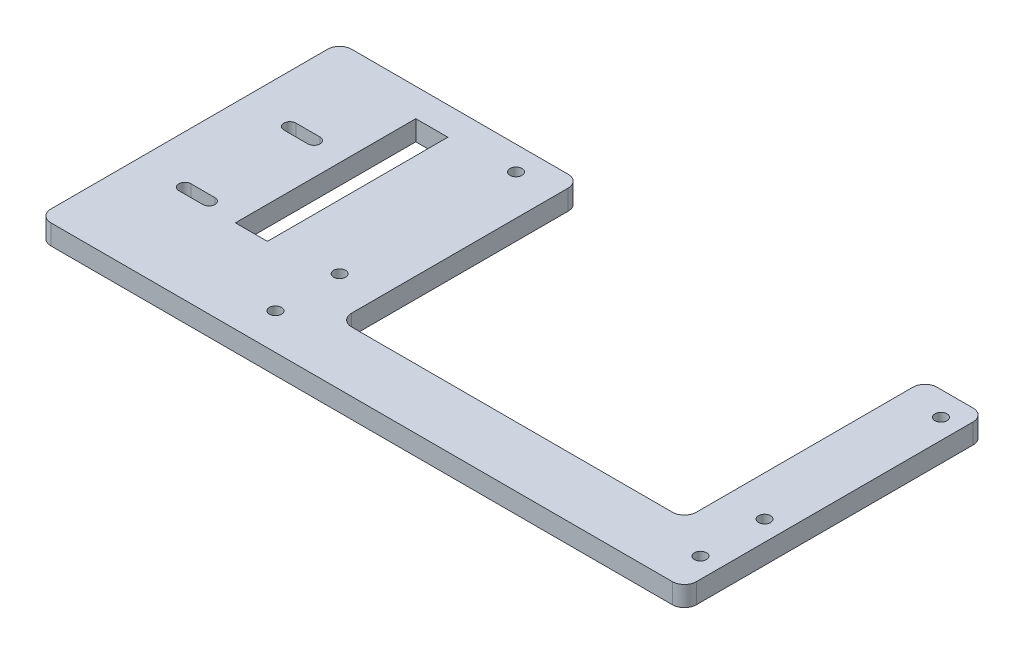
ISO-10303-21;
HEADER;
FILE_DESCRIPTION(('STEP AP214'),'2;1');
FILE_NAME('part.step','',(''),(''),'','','');
FILE_SCHEMA(('AUTOMOTIVE_DESIGN { 1 0 10303 214 1 1 1 1 }'));
ENDSEC;
DATA;
#1=APPLICATION_CONTEXT('core data for automotive mechanical design processes');
#2=APPLICATION_PROTOCOL_DEFINITION('international standard','automotive_design',2000,#1);
#3=PRODUCT_CONTEXT('',#1,'mechanical');
#4=PRODUCT('Part','Part','',(#3));
#5=PRODUCT_RELATED_PRODUCT_CATEGORY('part','',(#4));
#6=PRODUCT_DEFINITION_FORMATION('','',#4);
#7=PRODUCT_DEFINITION_CONTEXT('part definition',#1,'design');
#8=PRODUCT_DEFINITION('design','',#6,#7);
#9=PRODUCT_DEFINITION_SHAPE('','',#8);
#10=(LENGTH_UNIT() NAMED_UNIT(*) SI_UNIT(.MILLI.,.METRE.));
#11=(NAMED_UNIT(*) PLANE_ANGLE_UNIT() SI_UNIT($,.RADIAN.));
#12=(NAMED_UNIT(*) SI_UNIT($,.STERADIAN.) SOLID_ANGLE_UNIT());
#13=UNCERTAINTY_MEASURE_WITH_UNIT(LENGTH_MEASURE(1.E-05),#10,'distance_accuracy_value','');
#14=(GEOMETRIC_REPRESENTATION_CONTEXT(3) GLOBAL_UNCERTAINTY_ASSIGNED_CONTEXT((#13)) GLOBAL_UNIT_ASSIGNED_CONTEXT((#10,
#11,#12)) REPRESENTATION_CONTEXT('',''));
#15=CARTESIAN_POINT('',(0.,0.,0.));
#16=DIRECTION('',(0.,0.,1.));
#17=DIRECTION('',(1.,0.,0.));
#18=AXIS2_PLACEMENT_3D('',#15,#16,#17);
#19=CARTESIAN_POINT('',(0.,5.,0.));
#20=DIRECTION('',(0.,-1.,0.));
#21=DIRECTION('',(0.,0.,-1.));
#22=AXIS2_PLACEMENT_3D('',#19,#20,#21);
#23=PLANE('',#22);
#24=DIRECTION('',(1.,0.,0.));
#25=VECTOR('',#24,1.);
#26=CARTESIAN_POINT('',(-48.,5.,-34.1));
#27=LINE('',#26,#25);
#28=CARTESIAN_POINT('',(-48.,5.,-34.1));
#29=VERTEX_POINT('',#28);
#30=CARTESIAN_POINT('',(-42.,5.,-34.1));
#31=VERTEX_POINT('',#30);
#32=EDGE_CURVE('E259',#29,#31,#27,.T.);
#33=ORIENTED_EDGE('',*,*,#32,.F.);
#34=CARTESIAN_POINT('',(-48.,5.,-35.6));
#35=DIRECTION('',(0.,1.,0.));
#36=DIRECTION('',(0.,0.,1.));
#37=AXIS2_PLACEMENT_3D('',#34,#35,#36);
#38=CIRCLE('',#37,1.5);
#39=CARTESIAN_POINT('',(-48.,5.,-37.1));
#40=VERTEX_POINT('',#39);
#41=EDGE_CURVE('E59',#40,#29,#38,.T.);
#42=ORIENTED_EDGE('',*,*,#41,.F.);
#43=DIRECTION('',(-1.,0.,0.));
#44=VECTOR('',#43,1.);
#45=CARTESIAN_POINT('',(-48.,5.,-37.1));
#46=LINE('',#45,#44);
#47=CARTESIAN_POINT('',(-42.,5.,-37.1));
#48=VERTEX_POINT('',#47);
#49=EDGE_CURVE('E247',#48,#40,#46,.T.);
#50=ORIENTED_EDGE('',*,*,#49,.F.);
#51=CARTESIAN_POINT('',(-42.,5.,-35.6));
#52=DIRECTION('',(0.,1.,0.));
#53=DIRECTION('',(0.,0.,1.));
#54=AXIS2_PLACEMENT_3D('',#51,#52,#53);
#55=CIRCLE('',#54,1.5);
#56=EDGE_CURVE('E252',#31,#48,#55,.T.);
#57=ORIENTED_EDGE('',*,*,#56,.F.);
#58=EDGE_LOOP('',(#33,#42,#50,#57));
#59=FACE_BOUND('',#58,.T.);
#60=DIRECTION('',(1.,0.,0.));
#61=VECTOR('',#60,1.);
#62=CARTESIAN_POINT('',(-48.,5.,-7.9));
#63=LINE('',#62,#61);
#64=CARTESIAN_POINT('',(-48.,5.,-7.9));
#65=VERTEX_POINT('',#64);
#66=CARTESIAN_POINT('',(-42.,5.,-7.90000000000001));
#67=VERTEX_POINT('',#66);
#68=EDGE_CURVE('E284',#65,#67,#63,.T.);
#69=ORIENTED_EDGE('',*,*,#68,.F.);
#70=CARTESIAN_POINT('',(-48.,5.,-9.4));
#71=DIRECTION('',(0.,1.,0.));
#72=DIRECTION('',(0.,0.,-1.));
#73=AXIS2_PLACEMENT_3D('',#70,#71,#72);
#74=CIRCLE('',#73,1.5);
#75=CARTESIAN_POINT('',(-48.,5.,-10.9));
#76=VERTEX_POINT('',#75);
#77=EDGE_CURVE('E67',#76,#65,#74,.T.);
#78=ORIENTED_EDGE('',*,*,#77,.F.);
#79=DIRECTION('',(-1.,0.,0.));
#80=VECTOR('',#79,1.);
#81=CARTESIAN_POINT('',(-48.,5.,-10.9));
#82=LINE('',#81,#80);
#83=CARTESIAN_POINT('',(-42.,5.,-10.9));
#84=VERTEX_POINT('',#83);
#85=EDGE_CURVE('E278',#84,#76,#82,.T.);
#86=ORIENTED_EDGE('',*,*,#85,.F.);
#87=CARTESIAN_POINT('',(-42.,5.,-9.40000000000001));
#88=DIRECTION('',(0.,1.,0.));
#89=DIRECTION('',(0.,0.,-1.));
#90=AXIS2_PLACEMENT_3D('',#87,#88,#89);
#91=CIRCLE('',#90,1.5);
#92=EDGE_CURVE('E280',#67,#84,#91,.T.);
#93=ORIENTED_EDGE('',*,*,#92,.F.);
#94=EDGE_LOOP('',(#69,#78,#86,#93));
#95=FACE_BOUND('',#94,.T.);
#96=DIRECTION('',(1.,0.,0.));
#97=VECTOR('',#96,1.);
#98=CARTESIAN_POINT('',(-34.,5.,-7.99999999999999));
#99=LINE('',#98,#97);
#100=CARTESIAN_POINT('',(-34.,5.,-7.99999999999999));
#101=VERTEX_POINT('',#100);
#102=CARTESIAN_POINT('',(-26.,5.,-7.99999999999999));
#103=VERTEX_POINT('',#102);
#104=EDGE_CURVE('E315',#101,#103,#99,.T.);
#105=ORIENTED_EDGE('',*,*,#104,.F.);
#106=DIRECTION('',(0.,0.,1.));
#107=VECTOR('',#106,1.);
#108=CARTESIAN_POINT('',(-34.,5.,-53.));
#109=LINE('',#108,#107);
#110=CARTESIAN_POINT('',(-34.,5.,-53.));
#111=VERTEX_POINT('',#110);
#112=EDGE_CURVE('E264',#111,#101,#109,.T.);
#113=ORIENTED_EDGE('',*,*,#112,.F.);
#114=DIRECTION('',(-1.,0.,0.));
#115=VECTOR('',#114,1.);
#116=CARTESIAN_POINT('',(-34.,5.,-53.));
#117=LINE('',#116,#115);
#118=CARTESIAN_POINT('',(-26.,5.,-53.));
#119=VERTEX_POINT('',#118);
#120=EDGE_CURVE('E301',#119,#111,#117,.T.);
#121=ORIENTED_EDGE('',*,*,#120,.F.);
#122=DIRECTION('',(0.,0.,-1.));
#123=VECTOR('',#122,1.);
#124=CARTESIAN_POINT('',(-26.,5.,-53.));
#125=LINE('',#124,#123);
#126=EDGE_CURVE('E314',#103,#119,#125,.T.);
#127=ORIENTED_EDGE('',*,*,#126,.F.);
#128=EDGE_LOOP('',(#105,#113,#121,#127));
#129=FACE_BOUND('',#128,.T.);
#130=DIRECTION('',(1.,0.,0.));
#131=VECTOR('',#130,1.);
#132=CARTESIAN_POINT('',(-60.,5.,15.));
#133=LINE('',#132,#131);
#134=CARTESIAN_POINT('',(-57.,5.,15.));
#135=VERTEX_POINT('',#134);
#136=CARTESIAN_POINT('',(98.,5.,15.));
#137=VERTEX_POINT('',#136);
#138=EDGE_CURVE('E377',#135,#137,#133,.T.);
#139=ORIENTED_EDGE('',*,*,#138,.T.);
#140=CARTESIAN_POINT('',(98.,5.,12.));
#141=DIRECTION('',(0.,-1.,0.));
#142=DIRECTION('',(0.,0.,-1.));
#143=AXIS2_PLACEMENT_3D('',#140,#141,#142);
#144=CIRCLE('',#143,3.);
#145=CARTESIAN_POINT('',(101.,5.,12.));
#146=VERTEX_POINT('',#145);
#147=EDGE_CURVE('E443',#137,#146,#144,.F.);
#148=ORIENTED_EDGE('',*,*,#147,.T.);
#149=DIRECTION('',(0.,0.,-1.));
#150=VECTOR('',#149,1.);
#151=CARTESIAN_POINT('',(101.,5.,15.));
#152=LINE('',#151,#150);
#153=CARTESIAN_POINT('',(101.,5.,-57.));
#154=VERTEX_POINT('',#153);
#155=EDGE_CURVE('E382',#146,#154,#152,.T.);
#156=ORIENTED_EDGE('',*,*,#155,.T.);
#157=CARTESIAN_POINT('',(98.,5.,-57.));
#158=DIRECTION('',(0.,-1.,0.));
#159=DIRECTION('',(0.,0.,-1.));
#160=AXIS2_PLACEMENT_3D('',#157,#158,#159);
#161=CIRCLE('',#160,3.);
#162=CARTESIAN_POINT('',(98.,5.,-60.));
#163=VERTEX_POINT('',#162);
#164=EDGE_CURVE('E439',#154,#163,#161,.F.);
#165=ORIENTED_EDGE('',*,*,#164,.T.);
#166=DIRECTION('',(-1.,0.,0.));
#167=VECTOR('',#166,1.);
#168=CARTESIAN_POINT('',(101.,5.,-60.));
#169=LINE('',#168,#167);
#170=CARTESIAN_POINT('',(89.,5.,-60.));
#171=VERTEX_POINT('',#170);
#172=EDGE_CURVE('E381',#163,#171,#169,.T.);
#173=ORIENTED_EDGE('',*,*,#172,.T.);
#174=CARTESIAN_POINT('',(89.,5.,-57.));
#175=DIRECTION('',(0.,-1.,0.));
#176=DIRECTION('',(0.,0.,-1.));
#177=AXIS2_PLACEMENT_3D('',#174,#175,#176);
#178=CIRCLE('',#177,3.);
#179=CARTESIAN_POINT('',(86.,5.,-57.));
#180=VERTEX_POINT('',#179);
#181=EDGE_CURVE('E438',#171,#180,#178,.F.);
#182=ORIENTED_EDGE('',*,*,#181,.T.);
#183=DIRECTION('',(0.,0.,1.));
#184=VECTOR('',#183,1.);
#185=CARTESIAN_POINT('',(86.,5.,-60.));
#186=LINE('',#185,#184);
#187=CARTESIAN_POINT('',(86.,5.,-3.));
#188=VERTEX_POINT('',#187);
#189=EDGE_CURVE('E389',#180,#188,#186,.T.);
#190=ORIENTED_EDGE('',*,*,#189,.T.);
#191=CARTESIAN_POINT('',(83.,5.,-3.));
#192=DIRECTION('',(0.,-1.,0.));
#193=DIRECTION('',(0.,0.,-1.));
#194=AXIS2_PLACEMENT_3D('',#191,#192,#193);
#195=CIRCLE('',#194,3.);
#196=CARTESIAN_POINT('',(83.,5.,0.));
#197=VERTEX_POINT('',#196);
#198=EDGE_CURVE('E11',#188,#197,#195,.T.);
#199=ORIENTED_EDGE('',*,*,#198,.T.);
#200=DIRECTION('',(-1.,0.,0.));
#201=VECTOR('',#200,1.);
#202=CARTESIAN_POINT('',(86.,5.,0.));
#203=LINE('',#202,#201);
#204=CARTESIAN_POINT('',(3.,5.,0.));
#205=VERTEX_POINT('',#204);
#206=EDGE_CURVE('E362',#197,#205,#203,.T.);
#207=ORIENTED_EDGE('',*,*,#206,.T.);
#208=CARTESIAN_POINT('',(3.,5.,-3.));
#209=DIRECTION('',(0.,-1.,0.));
#210=DIRECTION('',(0.,0.,-1.));
#211=AXIS2_PLACEMENT_3D('',#208,#209,#210);
#212=CIRCLE('',#211,3.);
#213=CARTESIAN_POINT('',(0.,5.,-3.));
#214=VERTEX_POINT('',#213);
#215=EDGE_CURVE('E479',#205,#214,#212,.T.);
#216=ORIENTED_EDGE('',*,*,#215,.T.);
#217=DIRECTION('',(0.,0.,-1.));
#218=VECTOR('',#217,1.);
#219=CARTESIAN_POINT('',(0.,5.,0.));
#220=LINE('',#219,#218);
#221=CARTESIAN_POINT('',(0.,5.,-57.));
#222=VERTEX_POINT('',#221);
#223=EDGE_CURVE('E368',#214,#222,#220,.T.);
#224=ORIENTED_EDGE('',*,*,#223,.T.);
#225=CARTESIAN_POINT('',(-3.,5.,-57.));
#226=DIRECTION('',(0.,-1.,0.));
#227=DIRECTION('',(0.,0.,-1.));
#228=AXIS2_PLACEMENT_3D('',#225,#226,#227);
#229=CIRCLE('',#228,3.);
#230=CARTESIAN_POINT('',(-3.,5.,-60.));
#231=VERTEX_POINT('',#230);
#232=EDGE_CURVE('E436',#222,#231,#229,.F.);
#233=ORIENTED_EDGE('',*,*,#232,.T.);
#234=DIRECTION('',(-1.,0.,0.));
#235=VECTOR('',#234,1.);
#236=CARTESIAN_POINT('',(0.,5.,-60.));
#237=LINE('',#236,#235);
#238=CARTESIAN_POINT('',(-57.,5.,-60.));
#239=VERTEX_POINT('',#238);
#240=EDGE_CURVE('E375',#231,#239,#237,.T.);
#241=ORIENTED_EDGE('',*,*,#240,.T.);
#242=CARTESIAN_POINT('',(-57.,5.,-57.));
#243=DIRECTION('',(0.,-1.,0.));
#244=DIRECTION('',(0.,0.,-1.));
#245=AXIS2_PLACEMENT_3D('',#242,#243,#244);
#246=CIRCLE('',#245,3.);
#247=CARTESIAN_POINT('',(-60.,5.,-57.));
#248=VERTEX_POINT('',#247);
#249=EDGE_CURVE('E432',#239,#248,#246,.F.);
#250=ORIENTED_EDGE('',*,*,#249,.T.);
#251=DIRECTION('',(0.,0.,1.));
#252=VECTOR('',#251,1.);
#253=CARTESIAN_POINT('',(-60.,5.,-60.));
#254=LINE('',#253,#252);
#255=CARTESIAN_POINT('',(-60.,5.,12.));
#256=VERTEX_POINT('',#255);
#257=EDGE_CURVE('E374',#248,#256,#254,.T.);
#258=ORIENTED_EDGE('',*,*,#257,.T.);
#259=CARTESIAN_POINT('',(-57.,5.,12.));
#260=DIRECTION('',(0.,-1.,0.));
#261=DIRECTION('',(0.,0.,-1.));
#262=AXIS2_PLACEMENT_3D('',#259,#260,#261);
#263=CIRCLE('',#262,3.);
#264=EDGE_CURVE('E445',#256,#135,#263,.F.);
#265=ORIENTED_EDGE('',*,*,#264,.T.);
#266=EDGE_LOOP('',(#139,#148,#156,#165,#173,#182,#190,#199,#207,#216,#224,#233,#241,#250,#258,#265));
#267=FACE_BOUND('',#266,.T.);
#268=CARTESIAN_POINT('',(-10.,5.,-54.));
#269=DIRECTION('',(0.,1.,0.));
#270=DIRECTION('',(0.,0.,1.));
#271=AXIS2_PLACEMENT_3D('',#268,#269,#270);
#272=CIRCLE('',#271,1.5);
#273=CARTESIAN_POINT('',(-10.,5.,-52.5));
#274=VERTEX_POINT('',#273);
#275=EDGE_CURVE('E360',#274,#274,#272,.T.);
#276=ORIENTED_EDGE('',*,*,#275,.F.);
#277=EDGE_LOOP('',(#276));
#278=FACE_BOUND('',#277,.T.);
#279=CARTESIAN_POINT('',(-10.,5.,6.00000000000002));
#280=DIRECTION('',(0.,1.,0.));
#281=DIRECTION('',(0.,0.,-1.));
#282=AXIS2_PLACEMENT_3D('',#279,#280,#281);
#283=CIRCLE('',#282,1.5);
#284=CARTESIAN_POINT('',(-10.,5.,4.50000000000002));
#285=VERTEX_POINT('',#284);
#286=EDGE_CURVE('E354',#285,#285,#283,.T.);
#287=ORIENTED_EDGE('',*,*,#286,.F.);
#288=EDGE_LOOP('',(#287));
#289=FACE_BOUND('',#288,.T.);
#290=CARTESIAN_POINT('',(96.,5.,-54.));
#291=DIRECTION('',(0.,1.,0.));
#292=DIRECTION('',(0.,0.,1.));
#293=AXIS2_PLACEMENT_3D('',#290,#291,#292);
#294=CIRCLE('',#293,1.5);
#295=CARTESIAN_POINT('',(96.,5.,-52.5));
#296=VERTEX_POINT('',#295);
#297=EDGE_CURVE('E350',#296,#296,#294,.T.);
#298=ORIENTED_EDGE('',*,*,#297,.F.);
#299=EDGE_LOOP('',(#298));
#300=FACE_BOUND('',#299,.T.);
#301=CARTESIAN_POINT('',(96.,5.,6.00000000000002));
#302=DIRECTION('',(0.,1.,0.));
#303=DIRECTION('',(0.,0.,1.));
#304=AXIS2_PLACEMENT_3D('',#301,#302,#303);
#305=CIRCLE('',#304,1.5);
#306=CARTESIAN_POINT('',(96.,5.,7.50000000000001));
#307=VERTEX_POINT('',#306);
#308=EDGE_CURVE('E343',#307,#307,#305,.T.);
#309=ORIENTED_EDGE('',*,*,#308,.F.);
#310=EDGE_LOOP('',(#309));
#311=FACE_BOUND('',#310,.T.);
#312=CARTESIAN_POINT('',(96.,5.,-9.99999999999999));
#313=DIRECTION('',(0.,1.,0.));
#314=DIRECTION('',(0.,0.,1.));
#315=AXIS2_PLACEMENT_3D('',#312,#313,#314);
#316=CIRCLE('',#315,1.5);
#317=CARTESIAN_POINT('',(96.,5.,-8.49999999999999));
#318=VERTEX_POINT('',#317);
#319=EDGE_CURVE('E335',#318,#318,#316,.T.);
#320=ORIENTED_EDGE('',*,*,#319,.F.);
#321=EDGE_LOOP('',(#320));
#322=FACE_BOUND('',#321,.T.);
#323=CARTESIAN_POINT('',(-9.99999999999999,5.,-9.99999999999998));
#324=DIRECTION('',(0.,1.,0.));
#325=DIRECTION('',(0.,0.,-1.));
#326=AXIS2_PLACEMENT_3D('',#323,#324,#325);
#327=CIRCLE('',#326,1.5);
#328=CARTESIAN_POINT('',(-9.99999999999999,5.,-11.5));
#329=VERTEX_POINT('',#328);
#330=EDGE_CURVE('E326',#329,#329,#327,.T.);
#331=ORIENTED_EDGE('',*,*,#330,.F.);
#332=EDGE_LOOP('',(#331));
#333=FACE_BOUND('',#332,.T.);
#334=ADVANCED_FACE('F43',(#59,#95,#129,#267,#278,#289,#300,#311,#322,#333),#23,.F.);
#335=CARTESIAN_POINT('',(0.,0.,0.));
#336=DIRECTION('',(0.,-1.,0.));
#337=DIRECTION('',(0.,0.,-1.));
#338=AXIS2_PLACEMENT_3D('',#335,#336,#337);
#339=PLANE('',#338);
#340=CARTESIAN_POINT('',(-48.,0.,-35.6));
#341=DIRECTION('',(0.,1.,0.));
#342=DIRECTION('',(0.,0.,1.));
#343=AXIS2_PLACEMENT_3D('',#340,#341,#342);
#344=CIRCLE('',#343,1.5);
#345=CARTESIAN_POINT('',(-48.,0.,-37.1));
#346=VERTEX_POINT('',#345);
#347=CARTESIAN_POINT('',(-48.,0.,-34.1));
#348=VERTEX_POINT('',#347);
#349=EDGE_CURVE('E230',#346,#348,#344,.T.);
#350=ORIENTED_EDGE('',*,*,#349,.T.);
#351=DIRECTION('',(1.,0.,0.));
#352=VECTOR('',#351,1.);
#353=CARTESIAN_POINT('',(-48.,0.,-34.1));
#354=LINE('',#353,#352);
#355=CARTESIAN_POINT('',(-42.,0.,-34.1));
#356=VERTEX_POINT('',#355);
#357=EDGE_CURVE('E237',#348,#356,#354,.T.);
#358=ORIENTED_EDGE('',*,*,#357,.T.);
#359=CARTESIAN_POINT('',(-42.,0.,-35.6));
#360=DIRECTION('',(0.,1.,0.));
#361=DIRECTION('',(0.,0.,1.));
#362=AXIS2_PLACEMENT_3D('',#359,#360,#361);
#363=CIRCLE('',#362,1.5);
#364=CARTESIAN_POINT('',(-42.,0.,-37.1));
#365=VERTEX_POINT('',#364);
#366=EDGE_CURVE('E243',#356,#365,#363,.T.);
#367=ORIENTED_EDGE('',*,*,#366,.T.);
#368=DIRECTION('',(-1.,0.,0.));
#369=VECTOR('',#368,1.);
#370=CARTESIAN_POINT('',(-48.,0.,-37.1));
#371=LINE('',#370,#369);
#372=EDGE_CURVE('E232',#365,#346,#371,.T.);
#373=ORIENTED_EDGE('',*,*,#372,.T.);
#374=EDGE_LOOP('',(#350,#358,#367,#373));
#375=FACE_BOUND('',#374,.T.);
#376=CARTESIAN_POINT('',(-48.,0.,-9.4));
#377=DIRECTION('',(0.,1.,0.));
#378=DIRECTION('',(0.,0.,-1.));
#379=AXIS2_PLACEMENT_3D('',#376,#377,#378);
#380=CIRCLE('',#379,1.5);
#381=CARTESIAN_POINT('',(-48.,0.,-10.9));
#382=VERTEX_POINT('',#381);
#383=CARTESIAN_POINT('',(-48.,0.,-7.9));
#384=VERTEX_POINT('',#383);
#385=EDGE_CURVE('E276',#382,#384,#380,.T.);
#386=ORIENTED_EDGE('',*,*,#385,.T.);
#387=DIRECTION('',(1.,0.,0.));
#388=VECTOR('',#387,1.);
#389=CARTESIAN_POINT('',(-48.,0.,-7.9));
#390=LINE('',#389,#388);
#391=CARTESIAN_POINT('',(-42.,0.,-7.90000000000001));
#392=VERTEX_POINT('',#391);
#393=EDGE_CURVE('E292',#384,#392,#390,.T.);
#394=ORIENTED_EDGE('',*,*,#393,.T.);
#395=CARTESIAN_POINT('',(-42.,0.,-9.40000000000001));
#396=DIRECTION('',(0.,1.,0.));
#397=DIRECTION('',(0.,0.,-1.));
#398=AXIS2_PLACEMENT_3D('',#395,#396,#397);
#399=CIRCLE('',#398,1.5);
#400=CARTESIAN_POINT('',(-42.,0.,-10.9));
#401=VERTEX_POINT('',#400);
#402=EDGE_CURVE('E288',#392,#401,#399,.T.);
#403=ORIENTED_EDGE('',*,*,#402,.T.);
#404=DIRECTION('',(-1.,0.,0.));
#405=VECTOR('',#404,1.);
#406=CARTESIAN_POINT('',(-48.,0.,-10.9));
#407=LINE('',#406,#405);
#408=EDGE_CURVE('E268',#401,#382,#407,.T.);
#409=ORIENTED_EDGE('',*,*,#408,.T.);
#410=EDGE_LOOP('',(#386,#394,#403,#409));
#411=FACE_BOUND('',#410,.T.);
#412=DIRECTION('',(0.,0.,1.));
#413=VECTOR('',#412,1.);
#414=CARTESIAN_POINT('',(-34.,0.,-53.));
#415=LINE('',#414,#413);
#416=CARTESIAN_POINT('',(-34.,0.,-53.));
#417=VERTEX_POINT('',#416);
#418=CARTESIAN_POINT('',(-34.,0.,-7.99999999999999));
#419=VERTEX_POINT('',#418);
#420=EDGE_CURVE('E300',#417,#419,#415,.T.);
#421=ORIENTED_EDGE('',*,*,#420,.T.);
#422=DIRECTION('',(1.,0.,0.));
#423=VECTOR('',#422,1.);
#424=CARTESIAN_POINT('',(-34.,0.,-7.99999999999999));
#425=LINE('',#424,#423);
#426=CARTESIAN_POINT('',(-26.,0.,-7.99999999999999));
#427=VERTEX_POINT('',#426);
#428=EDGE_CURVE('E297',#419,#427,#425,.T.);
#429=ORIENTED_EDGE('',*,*,#428,.T.);
#430=DIRECTION('',(0.,0.,-1.));
#431=VECTOR('',#430,1.);
#432=CARTESIAN_POINT('',(-26.,0.,-53.));
#433=LINE('',#432,#431);
#434=CARTESIAN_POINT('',(-26.,0.,-53.));
#435=VERTEX_POINT('',#434);
#436=EDGE_CURVE('E302',#427,#435,#433,.T.);
#437=ORIENTED_EDGE('',*,*,#436,.T.);
#438=DIRECTION('',(-1.,0.,0.));
#439=VECTOR('',#438,1.);
#440=CARTESIAN_POINT('',(-34.,0.,-53.));
#441=LINE('',#440,#439);
#442=EDGE_CURVE('E310',#435,#417,#441,.T.);
#443=ORIENTED_EDGE('',*,*,#442,.T.);
#444=EDGE_LOOP('',(#421,#429,#437,#443));
#445=FACE_BOUND('',#444,.T.);
#446=CARTESIAN_POINT('',(96.,0.,-9.99999999999999));
#447=DIRECTION('',(0.,1.,0.));
#448=DIRECTION('',(0.,0.,1.));
#449=AXIS2_PLACEMENT_3D('',#446,#447,#448);
#450=CIRCLE('',#449,1.5);
#451=CARTESIAN_POINT('',(96.,0.,-8.49999999999999));
#452=VERTEX_POINT('',#451);
#453=EDGE_CURVE('E332',#452,#452,#450,.T.);
#454=ORIENTED_EDGE('',*,*,#453,.T.);
#455=EDGE_LOOP('',(#454));
#456=FACE_BOUND('',#455,.T.);
#457=CARTESIAN_POINT('',(96.,0.,-54.));
#458=DIRECTION('',(0.,1.,0.));
#459=DIRECTION('',(0.,0.,1.));
#460=AXIS2_PLACEMENT_3D('',#457,#458,#459);
#461=CIRCLE('',#460,1.5);
#462=CARTESIAN_POINT('',(96.,0.,-52.5));
#463=VERTEX_POINT('',#462);
#464=EDGE_CURVE('E345',#463,#463,#461,.T.);
#465=ORIENTED_EDGE('',*,*,#464,.T.);
#466=EDGE_LOOP('',(#465));
#467=FACE_BOUND('',#466,.T.);
#468=CARTESIAN_POINT('',(-10.,0.,-54.));
#469=DIRECTION('',(0.,1.,0.));
#470=DIRECTION('',(0.,0.,1.));
#471=AXIS2_PLACEMENT_3D('',#468,#469,#470);
#472=CIRCLE('',#471,1.5);
#473=CARTESIAN_POINT('',(-10.,0.,-52.5));
#474=VERTEX_POINT('',#473);
#475=EDGE_CURVE('E358',#474,#474,#472,.T.);
#476=ORIENTED_EDGE('',*,*,#475,.T.);
#477=EDGE_LOOP('',(#476));
#478=FACE_BOUND('',#477,.T.);
#479=DIRECTION('',(0.,0.,-1.));
#480=VECTOR('',#479,1.);
#481=CARTESIAN_POINT('',(101.,0.,15.));
#482=LINE('',#481,#480);
#483=CARTESIAN_POINT('',(101.,0.,12.));
#484=VERTEX_POINT('',#483);
#485=CARTESIAN_POINT('',(101.,0.,-57.));
#486=VERTEX_POINT('',#485);
#487=EDGE_CURVE('E403',#484,#486,#482,.T.);
#488=ORIENTED_EDGE('',*,*,#487,.F.);
#489=CARTESIAN_POINT('',(98.,0.,12.));
#490=DIRECTION('',(0.,-1.,0.));
#491=DIRECTION('',(0.,0.,-1.));
#492=AXIS2_PLACEMENT_3D('',#489,#490,#491);
#493=CIRCLE('',#492,3.);
#494=CARTESIAN_POINT('',(98.,0.,15.));
#495=VERTEX_POINT('',#494);
#496=EDGE_CURVE('E430',#484,#495,#493,.T.);
#497=ORIENTED_EDGE('',*,*,#496,.T.);
#498=DIRECTION('',(1.,0.,0.));
#499=VECTOR('',#498,1.);
#500=CARTESIAN_POINT('',(-60.,0.,15.));
#501=LINE('',#500,#499);
#502=CARTESIAN_POINT('',(-57.,0.,15.));
#503=VERTEX_POINT('',#502);
#504=EDGE_CURVE('E405',#503,#495,#501,.T.);
#505=ORIENTED_EDGE('',*,*,#504,.F.);
#506=CARTESIAN_POINT('',(-57.,0.,12.));
#507=DIRECTION('',(0.,-1.,0.));
#508=DIRECTION('',(0.,0.,-1.));
#509=AXIS2_PLACEMENT_3D('',#506,#507,#508);
#510=CIRCLE('',#509,3.);
#511=CARTESIAN_POINT('',(-60.,0.,12.));
#512=VERTEX_POINT('',#511);
#513=EDGE_CURVE('E424',#503,#512,#510,.T.);
#514=ORIENTED_EDGE('',*,*,#513,.T.);
#515=DIRECTION('',(0.,0.,1.));
#516=VECTOR('',#515,1.);
#517=CARTESIAN_POINT('',(-60.,0.,-60.));
#518=LINE('',#517,#516);
#519=CARTESIAN_POINT('',(-60.,0.,-57.));
#520=VERTEX_POINT('',#519);
#521=EDGE_CURVE('E398',#520,#512,#518,.T.);
#522=ORIENTED_EDGE('',*,*,#521,.F.);
#523=CARTESIAN_POINT('',(-57.,0.,-57.));
#524=DIRECTION('',(0.,-1.,0.));
#525=DIRECTION('',(0.,0.,-1.));
#526=AXIS2_PLACEMENT_3D('',#523,#524,#525);
#527=CIRCLE('',#526,3.);
#528=CARTESIAN_POINT('',(-57.,0.,-60.));
#529=VERTEX_POINT('',#528);
#530=EDGE_CURVE('E417',#520,#529,#527,.T.);
#531=ORIENTED_EDGE('',*,*,#530,.T.);
#532=DIRECTION('',(-1.,0.,0.));
#533=VECTOR('',#532,1.);
#534=CARTESIAN_POINT('',(0.,0.,-60.));
#535=LINE('',#534,#533);
#536=CARTESIAN_POINT('',(-3.,0.,-60.));
#537=VERTEX_POINT('',#536);
#538=EDGE_CURVE('E396',#537,#529,#535,.T.);
#539=ORIENTED_EDGE('',*,*,#538,.F.);
#540=CARTESIAN_POINT('',(-3.,0.,-57.));
#541=DIRECTION('',(0.,-1.,0.));
#542=DIRECTION('',(0.,0.,-1.));
#543=AXIS2_PLACEMENT_3D('',#540,#541,#542);
#544=CIRCLE('',#543,3.);
#545=CARTESIAN_POINT('',(0.,0.,-57.));
#546=VERTEX_POINT('',#545);
#547=EDGE_CURVE('E418',#537,#546,#544,.T.);
#548=ORIENTED_EDGE('',*,*,#547,.T.);
#549=DIRECTION('',(0.,0.,-1.));
#550=VECTOR('',#549,1.);
#551=CARTESIAN_POINT('',(0.,0.,0.));
#552=LINE('',#551,#550);
#553=CARTESIAN_POINT('',(0.,0.,-3.));
#554=VERTEX_POINT('',#553);
#555=EDGE_CURVE('E394',#554,#546,#552,.T.);
#556=ORIENTED_EDGE('',*,*,#555,.F.);
#557=CARTESIAN_POINT('',(3.,0.,-3.));
#558=DIRECTION('',(0.,-1.,0.));
#559=DIRECTION('',(0.,0.,-1.));
#560=AXIS2_PLACEMENT_3D('',#557,#558,#559);
#561=CIRCLE('',#560,3.);
#562=CARTESIAN_POINT('',(3.,0.,0.));
#563=VERTEX_POINT('',#562);
#564=EDGE_CURVE('E477',#554,#563,#561,.F.);
#565=ORIENTED_EDGE('',*,*,#564,.T.);
#566=DIRECTION('',(-1.,0.,0.));
#567=VECTOR('',#566,1.);
#568=CARTESIAN_POINT('',(86.,0.,0.));
#569=LINE('',#568,#567);
#570=CARTESIAN_POINT('',(83.,0.,0.));
#571=VERTEX_POINT('',#570);
#572=EDGE_CURVE('E365',#571,#563,#569,.T.);
#573=ORIENTED_EDGE('',*,*,#572,.F.);
#574=CARTESIAN_POINT('',(83.,0.,-3.));
#575=DIRECTION('',(0.,-1.,0.));
#576=DIRECTION('',(0.,0.,-1.));
#577=AXIS2_PLACEMENT_3D('',#574,#575,#576);
#578=CIRCLE('',#577,3.);
#579=CARTESIAN_POINT('',(86.,0.,-3.));
#580=VERTEX_POINT('',#579);
#581=EDGE_CURVE('E51',#571,#580,#578,.F.);
#582=ORIENTED_EDGE('',*,*,#581,.T.);
#583=DIRECTION('',(0.,0.,1.));
#584=VECTOR('',#583,1.);
#585=CARTESIAN_POINT('',(86.,0.,-60.));
#586=LINE('',#585,#584);
#587=CARTESIAN_POINT('',(86.,0.,-57.));
#588=VERTEX_POINT('',#587);
#589=EDGE_CURVE('E367',#588,#580,#586,.T.);
#590=ORIENTED_EDGE('',*,*,#589,.F.);
#591=CARTESIAN_POINT('',(89.,0.,-57.));
#592=DIRECTION('',(0.,-1.,0.));
#593=DIRECTION('',(0.,0.,-1.));
#594=AXIS2_PLACEMENT_3D('',#591,#592,#593);
#595=CIRCLE('',#594,3.);
#596=CARTESIAN_POINT('',(89.,0.,-60.));
#597=VERTEX_POINT('',#596);
#598=EDGE_CURVE('E423',#588,#597,#595,.T.);
#599=ORIENTED_EDGE('',*,*,#598,.T.);
#600=DIRECTION('',(-1.,0.,0.));
#601=VECTOR('',#600,1.);
#602=CARTESIAN_POINT('',(101.,0.,-60.));
#603=LINE('',#602,#601);
#604=CARTESIAN_POINT('',(98.,0.,-60.));
#605=VERTEX_POINT('',#604);
#606=EDGE_CURVE('E407',#605,#597,#603,.T.);
#607=ORIENTED_EDGE('',*,*,#606,.F.);
#608=CARTESIAN_POINT('',(98.,0.,-57.));
#609=DIRECTION('',(0.,-1.,0.));
#610=DIRECTION('',(0.,0.,-1.));
#611=AXIS2_PLACEMENT_3D('',#608,#609,#610);
#612=CIRCLE('',#611,3.);
#613=EDGE_CURVE('E421',#605,#486,#612,.T.);
#614=ORIENTED_EDGE('',*,*,#613,.T.);
#615=EDGE_LOOP('',(#488,#497,#505,#514,#522,#531,#539,#548,#556,#565,#573,#582,#590,#599,#607,#614));
#616=FACE_BOUND('',#615,.T.);
#617=CARTESIAN_POINT('',(-10.,0.,6.00000000000002));
#618=DIRECTION('',(0.,1.,0.));
#619=DIRECTION('',(0.,0.,-1.));
#620=AXIS2_PLACEMENT_3D('',#617,#618,#619);
#621=CIRCLE('',#620,1.5);
#622=CARTESIAN_POINT('',(-10.,0.,4.50000000000002));
#623=VERTEX_POINT('',#622);
#624=EDGE_CURVE('E348',#623,#623,#621,.T.);
#625=ORIENTED_EDGE('',*,*,#624,.T.);
#626=EDGE_LOOP('',(#625));
#627=FACE_BOUND('',#626,.T.);
#628=CARTESIAN_POINT('',(96.,0.,6.00000000000002));
#629=DIRECTION('',(0.,1.,0.));
#630=DIRECTION('',(0.,0.,1.));
#631=AXIS2_PLACEMENT_3D('',#628,#629,#630);
#632=CIRCLE('',#631,1.5);
#633=CARTESIAN_POINT('',(96.,0.,7.50000000000001));
#634=VERTEX_POINT('',#633);
#635=EDGE_CURVE('E336',#634,#634,#632,.T.);
#636=ORIENTED_EDGE('',*,*,#635,.T.);
#637=EDGE_LOOP('',(#636));
#638=FACE_BOUND('',#637,.T.);
#639=CARTESIAN_POINT('',(-9.99999999999999,0.,-9.99999999999998));
#640=DIRECTION('',(0.,1.,0.));
#641=DIRECTION('',(0.,0.,-1.));
#642=AXIS2_PLACEMENT_3D('',#639,#640,#641);
#643=CIRCLE('',#642,1.5);
#644=CARTESIAN_POINT('',(-9.99999999999999,0.,-11.5));
#645=VERTEX_POINT('',#644);
#646=EDGE_CURVE('E324',#645,#645,#643,.T.);
#647=ORIENTED_EDGE('',*,*,#646,.T.);
#648=EDGE_LOOP('',(#647));
#649=FACE_BOUND('',#648,.T.);
#650=ADVANCED_FACE('F244',(#375,#411,#445,#456,#467,#478,#616,#627,#638,#649),#339,.T.);
#651=CARTESIAN_POINT('',(86.,5.,0.));
#652=DIRECTION('',(0.,0.,1.));
#653=DIRECTION('',(1.,0.,0.));
#654=AXIS2_PLACEMENT_3D('',#651,#652,#653);
#655=PLANE('',#654);
#656=ORIENTED_EDGE('',*,*,#572,.T.);
#657=DIRECTION('',(0.,-1.,0.));
#658=VECTOR('',#657,1.);
#659=CARTESIAN_POINT('',(3.,5.,0.));
#660=LINE('',#659,#658);
#661=EDGE_CURVE('E456',#563,#205,#660,.F.);
#662=ORIENTED_EDGE('',*,*,#661,.T.);
#663=ORIENTED_EDGE('',*,*,#206,.F.);
#664=DIRECTION('',(0.,-1.,0.));
#665=VECTOR('',#664,1.);
#666=CARTESIAN_POINT('',(83.,0.,0.));
#667=LINE('',#666,#665);
#668=EDGE_CURVE('E457',#197,#571,#667,.T.);
#669=ORIENTED_EDGE('',*,*,#668,.T.);
#670=EDGE_LOOP('',(#656,#662,#663,#669));
#671=FACE_BOUND('',#670,.T.);
#672=ADVANCED_FACE('F498',(#671),#655,.F.);
#673=CARTESIAN_POINT('',(0.,5.,0.));
#674=DIRECTION('',(-1.,0.,0.));
#675=DIRECTION('',(0.,0.,1.));
#676=AXIS2_PLACEMENT_3D('',#673,#674,#675);
#677=PLANE('',#676);
#678=ORIENTED_EDGE('',*,*,#223,.F.);
#679=DIRECTION('',(0.,-1.,0.));
#680=VECTOR('',#679,1.);
#681=CARTESIAN_POINT('',(0.,0.,-3.));
#682=LINE('',#681,#680);
#683=EDGE_CURVE('E452',#214,#554,#682,.T.);
#684=ORIENTED_EDGE('',*,*,#683,.T.);
#685=ORIENTED_EDGE('',*,*,#555,.T.);
#686=DIRECTION('',(0.,-1.,0.));
#687=VECTOR('',#686,1.);
#688=CARTESIAN_POINT('',(0.,5.,-57.));
#689=LINE('',#688,#687);
#690=EDGE_CURVE('E453',#546,#222,#689,.F.);
#691=ORIENTED_EDGE('',*,*,#690,.T.);
#692=EDGE_LOOP('',(#678,#684,#685,#691));
#693=FACE_BOUND('',#692,.T.);
#694=ADVANCED_FACE('F506',(#693),#677,.F.);
#695=CARTESIAN_POINT('',(0.,5.,-60.));
#696=DIRECTION('',(0.,0.,1.));
#697=DIRECTION('',(1.,0.,0.));
#698=AXIS2_PLACEMENT_3D('',#695,#696,#697);
#699=PLANE('',#698);
#700=ORIENTED_EDGE('',*,*,#240,.F.);
#701=DIRECTION('',(0.,-1.,0.));
#702=VECTOR('',#701,1.);
#703=CARTESIAN_POINT('',(-3.,5.,-60.));
#704=LINE('',#703,#702);
#705=EDGE_CURVE('E472',#231,#537,#704,.T.);
#706=ORIENTED_EDGE('',*,*,#705,.T.);
#707=ORIENTED_EDGE('',*,*,#538,.T.);
#708=DIRECTION('',(0.,-1.,0.));
#709=VECTOR('',#708,1.);
#710=CARTESIAN_POINT('',(-57.,5.,-60.));
#711=LINE('',#710,#709);
#712=EDGE_CURVE('E473',#529,#239,#711,.F.);
#713=ORIENTED_EDGE('',*,*,#712,.T.);
#714=EDGE_LOOP('',(#700,#706,#707,#713));
#715=FACE_BOUND('',#714,.T.);
#716=ADVANCED_FACE('F513',(#715),#699,.F.);
#717=CARTESIAN_POINT('',(-60.,5.,-60.));
#718=DIRECTION('',(1.,0.,0.));
#719=DIRECTION('',(0.,0.,-1.));
#720=AXIS2_PLACEMENT_3D('',#717,#718,#719);
#721=PLANE('',#720);
#722=ORIENTED_EDGE('',*,*,#521,.T.);
#723=DIRECTION('',(0.,-1.,0.));
#724=VECTOR('',#723,1.);
#725=CARTESIAN_POINT('',(-60.,5.,12.));
#726=LINE('',#725,#724);
#727=EDGE_CURVE('E446',#512,#256,#726,.F.);
#728=ORIENTED_EDGE('',*,*,#727,.T.);
#729=ORIENTED_EDGE('',*,*,#257,.F.);
#730=DIRECTION('',(0.,-1.,0.));
#731=VECTOR('',#730,1.);
#732=CARTESIAN_POINT('',(-60.,5.,-57.));
#733=LINE('',#732,#731);
#734=EDGE_CURVE('E447',#248,#520,#733,.T.);
#735=ORIENTED_EDGE('',*,*,#734,.T.);
#736=EDGE_LOOP('',(#722,#728,#729,#735));
#737=FACE_BOUND('',#736,.T.);
#738=ADVANCED_FACE('F524',(#737),#721,.F.);
#739=CARTESIAN_POINT('',(-60.,5.,15.));
#740=DIRECTION('',(0.,0.,-1.));
#741=DIRECTION('',(-1.,0.,0.));
#742=AXIS2_PLACEMENT_3D('',#739,#740,#741);
#743=PLANE('',#742);
#744=ORIENTED_EDGE('',*,*,#504,.T.);
#745=DIRECTION('',(0.,-1.,0.));
#746=VECTOR('',#745,1.);
#747=CARTESIAN_POINT('',(98.,5.,15.));
#748=LINE('',#747,#746);
#749=EDGE_CURVE('E435',#495,#137,#748,.F.);
#750=ORIENTED_EDGE('',*,*,#749,.T.);
#751=ORIENTED_EDGE('',*,*,#138,.F.);
#752=DIRECTION('',(0.,-1.,0.));
#753=VECTOR('',#752,1.);
#754=CARTESIAN_POINT('',(-57.,5.,15.));
#755=LINE('',#754,#753);
#756=EDGE_CURVE('E429',#135,#503,#755,.T.);
#757=ORIENTED_EDGE('',*,*,#756,.T.);
#758=EDGE_LOOP('',(#744,#750,#751,#757));
#759=FACE_BOUND('',#758,.T.);
#760=ADVANCED_FACE('F535',(#759),#743,.F.);
#761=CARTESIAN_POINT('',(101.,5.,15.));
#762=DIRECTION('',(-1.,0.,0.));
#763=DIRECTION('',(0.,0.,1.));
#764=AXIS2_PLACEMENT_3D('',#761,#762,#763);
#765=PLANE('',#764);
#766=ORIENTED_EDGE('',*,*,#155,.F.);
#767=DIRECTION('',(0.,-1.,0.));
#768=VECTOR('',#767,1.);
#769=CARTESIAN_POINT('',(101.,5.,12.));
#770=LINE('',#769,#768);
#771=EDGE_CURVE('E411',#146,#484,#770,.T.);
#772=ORIENTED_EDGE('',*,*,#771,.T.);
#773=ORIENTED_EDGE('',*,*,#487,.T.);
#774=DIRECTION('',(0.,-1.,0.));
#775=VECTOR('',#774,1.);
#776=CARTESIAN_POINT('',(101.,5.,-57.));
#777=LINE('',#776,#775);
#778=EDGE_CURVE('E386',#486,#154,#777,.F.);
#779=ORIENTED_EDGE('',*,*,#778,.T.);
#780=EDGE_LOOP('',(#766,#772,#773,#779));
#781=FACE_BOUND('',#780,.T.);
#782=ADVANCED_FACE('F542',(#781),#765,.F.);
#783=CARTESIAN_POINT('',(101.,5.,-60.));
#784=DIRECTION('',(0.,0.,1.));
#785=DIRECTION('',(1.,0.,0.));
#786=AXIS2_PLACEMENT_3D('',#783,#784,#785);
#787=PLANE('',#786);
#788=ORIENTED_EDGE('',*,*,#172,.F.);
#789=DIRECTION('',(0.,-1.,0.));
#790=VECTOR('',#789,1.);
#791=CARTESIAN_POINT('',(98.,5.,-60.));
#792=LINE('',#791,#790);
#793=EDGE_CURVE('E466',#163,#605,#792,.T.);
#794=ORIENTED_EDGE('',*,*,#793,.T.);
#795=ORIENTED_EDGE('',*,*,#606,.T.);
#796=DIRECTION('',(0.,-1.,0.));
#797=VECTOR('',#796,1.);
#798=CARTESIAN_POINT('',(89.,5.,-60.));
#799=LINE('',#798,#797);
#800=EDGE_CURVE('E467',#597,#171,#799,.F.);
#801=ORIENTED_EDGE('',*,*,#800,.T.);
#802=EDGE_LOOP('',(#788,#794,#795,#801));
#803=FACE_BOUND('',#802,.T.);
#804=ADVANCED_FACE('F548',(#803),#787,.F.);
#805=CARTESIAN_POINT('',(86.,5.,-60.));
#806=DIRECTION('',(1.,0.,0.));
#807=DIRECTION('',(0.,0.,-1.));
#808=AXIS2_PLACEMENT_3D('',#805,#806,#807);
#809=PLANE('',#808);
#810=ORIENTED_EDGE('',*,*,#589,.T.);
#811=DIRECTION('',(0.,-1.,0.));
#812=VECTOR('',#811,1.);
#813=CARTESIAN_POINT('',(86.,5.,-3.));
#814=LINE('',#813,#812);
#815=EDGE_CURVE('E463',#580,#188,#814,.F.);
#816=ORIENTED_EDGE('',*,*,#815,.T.);
#817=ORIENTED_EDGE('',*,*,#189,.F.);
#818=DIRECTION('',(0.,-1.,0.));
#819=VECTOR('',#818,1.);
#820=CARTESIAN_POINT('',(86.,5.,-57.));
#821=LINE('',#820,#819);
#822=EDGE_CURVE('E461',#180,#588,#821,.T.);
#823=ORIENTED_EDGE('',*,*,#822,.T.);
#824=EDGE_LOOP('',(#810,#816,#817,#823));
#825=FACE_BOUND('',#824,.T.);
#826=ADVANCED_FACE('F486',(#825),#809,.F.);
#827=CARTESIAN_POINT('',(-10.,5.,-54.));
#828=DIRECTION('',(0.,-1.,0.));
#829=DIRECTION('',(0.,0.,-1.));
#830=AXIS2_PLACEMENT_3D('',#827,#828,#829);
#831=CYLINDRICAL_SURFACE('',#830,1.5);
#832=ORIENTED_EDGE('',*,*,#275,.T.);
#833=EDGE_LOOP('',(#832));
#834=FACE_BOUND('',#833,.T.);
#835=ORIENTED_EDGE('',*,*,#475,.F.);
#836=EDGE_LOOP('',(#835));
#837=FACE_BOUND('',#836,.T.);
#838=ADVANCED_FACE('F571',(#834,#837),#831,.F.);
#839=CARTESIAN_POINT('',(-10.,5.,6.00000000000002));
#840=DIRECTION('',(0.,-1.,0.));
#841=DIRECTION('',(0.,0.,-1.));
#842=AXIS2_PLACEMENT_3D('',#839,#840,#841);
#843=CYLINDRICAL_SURFACE('',#842,1.5);
#844=ORIENTED_EDGE('',*,*,#286,.T.);
#845=EDGE_LOOP('',(#844));
#846=FACE_BOUND('',#845,.T.);
#847=ORIENTED_EDGE('',*,*,#624,.F.);
#848=EDGE_LOOP('',(#847));
#849=FACE_BOUND('',#848,.T.);
#850=ADVANCED_FACE('F734',(#846,#849),#843,.F.);
#851=CARTESIAN_POINT('',(96.,5.,-54.));
#852=DIRECTION('',(0.,-1.,0.));
#853=DIRECTION('',(0.,0.,-1.));
#854=AXIS2_PLACEMENT_3D('',#851,#852,#853);
#855=CYLINDRICAL_SURFACE('',#854,1.5);
#856=ORIENTED_EDGE('',*,*,#297,.T.);
#857=EDGE_LOOP('',(#856));
#858=FACE_BOUND('',#857,.T.);
#859=ORIENTED_EDGE('',*,*,#464,.F.);
#860=EDGE_LOOP('',(#859));
#861=FACE_BOUND('',#860,.T.);
#862=ADVANCED_FACE('F729',(#858,#861),#855,.F.);
#863=CARTESIAN_POINT('',(96.,5.,6.00000000000002));
#864=DIRECTION('',(0.,-1.,0.));
#865=DIRECTION('',(0.,0.,-1.));
#866=AXIS2_PLACEMENT_3D('',#863,#864,#865);
#867=CYLINDRICAL_SURFACE('',#866,1.5);
#868=ORIENTED_EDGE('',*,*,#308,.T.);
#869=EDGE_LOOP('',(#868));
#870=FACE_BOUND('',#869,.T.);
#871=ORIENTED_EDGE('',*,*,#635,.F.);
#872=EDGE_LOOP('',(#871));
#873=FACE_BOUND('',#872,.T.);
#874=ADVANCED_FACE('F725',(#870,#873),#867,.F.);
#875=CARTESIAN_POINT('',(96.,5.,-9.99999999999999));
#876=DIRECTION('',(0.,-1.,0.));
#877=DIRECTION('',(0.,0.,-1.));
#878=AXIS2_PLACEMENT_3D('',#875,#876,#877);
#879=CYLINDRICAL_SURFACE('',#878,1.5);
#880=ORIENTED_EDGE('',*,*,#319,.T.);
#881=EDGE_LOOP('',(#880));
#882=FACE_BOUND('',#881,.T.);
#883=ORIENTED_EDGE('',*,*,#453,.F.);
#884=EDGE_LOOP('',(#883));
#885=FACE_BOUND('',#884,.T.);
#886=ADVANCED_FACE('F721',(#882,#885),#879,.F.);
#887=CARTESIAN_POINT('',(-9.99999999999999,5.,-9.99999999999998));
#888=DIRECTION('',(0.,-1.,0.));
#889=DIRECTION('',(0.,0.,-1.));
#890=AXIS2_PLACEMENT_3D('',#887,#888,#889);
#891=CYLINDRICAL_SURFACE('',#890,1.5);
#892=ORIENTED_EDGE('',*,*,#330,.T.);
#893=EDGE_LOOP('',(#892));
#894=FACE_BOUND('',#893,.T.);
#895=ORIENTED_EDGE('',*,*,#646,.F.);
#896=EDGE_LOOP('',(#895));
#897=FACE_BOUND('',#896,.T.);
#898=ADVANCED_FACE('F720',(#894,#897),#891,.F.);
#899=CARTESIAN_POINT('',(-34.,0.,-53.));
#900=DIRECTION('',(-1.,0.,0.));
#901=DIRECTION('',(0.,0.,1.));
#902=AXIS2_PLACEMENT_3D('',#899,#900,#901);
#903=PLANE('',#902);
#904=ORIENTED_EDGE('',*,*,#112,.T.);
#905=DIRECTION('',(0.,1.,0.));
#906=VECTOR('',#905,1.);
#907=CARTESIAN_POINT('',(-34.,0.,-7.99999999999999));
#908=LINE('',#907,#906);
#909=EDGE_CURVE('E309',#419,#101,#908,.T.);
#910=ORIENTED_EDGE('',*,*,#909,.F.);
#911=ORIENTED_EDGE('',*,*,#420,.F.);
#912=DIRECTION('',(0.,1.,0.));
#913=VECTOR('',#912,1.);
#914=CARTESIAN_POINT('',(-34.,0.,-53.));
#915=LINE('',#914,#913);
#916=EDGE_CURVE('E318',#417,#111,#915,.T.);
#917=ORIENTED_EDGE('',*,*,#916,.T.);
#918=EDGE_LOOP('',(#904,#910,#911,#917));
#919=FACE_BOUND('',#918,.T.);
#920=ADVANCED_FACE('F710',(#919),#903,.F.);
#921=CARTESIAN_POINT('',(-34.,0.,-53.));
#922=DIRECTION('',(0.,0.,-1.));
#923=DIRECTION('',(-1.,0.,0.));
#924=AXIS2_PLACEMENT_3D('',#921,#922,#923);
#925=PLANE('',#924);
#926=ORIENTED_EDGE('',*,*,#120,.T.);
#927=ORIENTED_EDGE('',*,*,#916,.F.);
#928=ORIENTED_EDGE('',*,*,#442,.F.);
#929=DIRECTION('',(0.,1.,0.));
#930=VECTOR('',#929,1.);
#931=CARTESIAN_POINT('',(-26.,0.,-53.));
#932=LINE('',#931,#930);
#933=EDGE_CURVE('E322',#435,#119,#932,.T.);
#934=ORIENTED_EDGE('',*,*,#933,.T.);
#935=EDGE_LOOP('',(#926,#927,#928,#934));
#936=FACE_BOUND('',#935,.T.);
#937=ADVANCED_FACE('F702',(#936),#925,.F.);
#938=CARTESIAN_POINT('',(-26.,0.,-53.));
#939=DIRECTION('',(1.,0.,0.));
#940=DIRECTION('',(0.,0.,-1.));
#941=AXIS2_PLACEMENT_3D('',#938,#939,#940);
#942=PLANE('',#941);
#943=ORIENTED_EDGE('',*,*,#126,.T.);
#944=ORIENTED_EDGE('',*,*,#933,.F.);
#945=ORIENTED_EDGE('',*,*,#436,.F.);
#946=DIRECTION('',(0.,1.,0.));
#947=VECTOR('',#946,1.);
#948=CARTESIAN_POINT('',(-26.,0.,-7.99999999999999));
#949=LINE('',#948,#947);
#950=EDGE_CURVE('E321',#427,#103,#949,.T.);
#951=ORIENTED_EDGE('',*,*,#950,.T.);
#952=EDGE_LOOP('',(#943,#944,#945,#951));
#953=FACE_BOUND('',#952,.T.);
#954=ADVANCED_FACE('F707',(#953),#942,.F.);
#955=CARTESIAN_POINT('',(-34.,0.,-7.99999999999999));
#956=DIRECTION('',(0.,0.,1.));
#957=DIRECTION('',(1.,0.,0.));
#958=AXIS2_PLACEMENT_3D('',#955,#956,#957);
#959=PLANE('',#958);
#960=ORIENTED_EDGE('',*,*,#104,.T.);
#961=ORIENTED_EDGE('',*,*,#950,.F.);
#962=ORIENTED_EDGE('',*,*,#428,.F.);
#963=ORIENTED_EDGE('',*,*,#909,.T.);
#964=EDGE_LOOP('',(#960,#961,#962,#963));
#965=FACE_BOUND('',#964,.T.);
#966=ADVANCED_FACE('F592',(#965),#959,.F.);
#967=CARTESIAN_POINT('',(98.,5.,12.));
#968=DIRECTION('',(0.,-1.,0.));
#969=DIRECTION('',(0.,0.,-1.));
#970=AXIS2_PLACEMENT_3D('',#967,#968,#969);
#971=CYLINDRICAL_SURFACE('',#970,3.);
#972=ORIENTED_EDGE('',*,*,#147,.F.);
#973=ORIENTED_EDGE('',*,*,#749,.F.);
#974=ORIENTED_EDGE('',*,*,#496,.F.);
#975=ORIENTED_EDGE('',*,*,#771,.F.);
#976=EDGE_LOOP('',(#972,#973,#974,#975));
#977=FACE_BOUND('',#976,.T.);
#978=ADVANCED_FACE('F538',(#977),#971,.T.);
#979=CARTESIAN_POINT('',(-57.,5.,12.));
#980=DIRECTION('',(0.,-1.,0.));
#981=DIRECTION('',(0.,0.,-1.));
#982=AXIS2_PLACEMENT_3D('',#979,#980,#981);
#983=CYLINDRICAL_SURFACE('',#982,3.);
#984=ORIENTED_EDGE('',*,*,#264,.F.);
#985=ORIENTED_EDGE('',*,*,#727,.F.);
#986=ORIENTED_EDGE('',*,*,#513,.F.);
#987=ORIENTED_EDGE('',*,*,#756,.F.);
#988=EDGE_LOOP('',(#984,#985,#986,#987));
#989=FACE_BOUND('',#988,.T.);
#990=ADVANCED_FACE('F527',(#989),#983,.T.);
#991=CARTESIAN_POINT('',(3.,5.,-3.));
#992=DIRECTION('',(0.,1.,0.));
#993=DIRECTION('',(0.,0.,1.));
#994=AXIS2_PLACEMENT_3D('',#991,#992,#993);
#995=CYLINDRICAL_SURFACE('',#994,3.);
#996=ORIENTED_EDGE('',*,*,#215,.F.);
#997=ORIENTED_EDGE('',*,*,#661,.F.);
#998=ORIENTED_EDGE('',*,*,#564,.F.);
#999=ORIENTED_EDGE('',*,*,#683,.F.);
#1000=EDGE_LOOP('',(#996,#997,#998,#999));
#1001=FACE_BOUND('',#1000,.T.);
#1002=ADVANCED_FACE('F501',(#1001),#995,.F.);
#1003=CARTESIAN_POINT('',(83.,5.,-3.));
#1004=DIRECTION('',(0.,1.,0.));
#1005=DIRECTION('',(0.,0.,1.));
#1006=AXIS2_PLACEMENT_3D('',#1003,#1004,#1005);
#1007=CYLINDRICAL_SURFACE('',#1006,3.);
#1008=ORIENTED_EDGE('',*,*,#198,.F.);
#1009=ORIENTED_EDGE('',*,*,#815,.F.);
#1010=ORIENTED_EDGE('',*,*,#581,.F.);
#1011=ORIENTED_EDGE('',*,*,#668,.F.);
#1012=EDGE_LOOP('',(#1008,#1009,#1010,#1011));
#1013=FACE_BOUND('',#1012,.T.);
#1014=ADVANCED_FACE('F495',(#1013),#1007,.F.);
#1015=CARTESIAN_POINT('',(98.,5.,-57.));
#1016=DIRECTION('',(0.,-1.,0.));
#1017=DIRECTION('',(0.,0.,-1.));
#1018=AXIS2_PLACEMENT_3D('',#1015,#1016,#1017);
#1019=CYLINDRICAL_SURFACE('',#1018,3.);
#1020=ORIENTED_EDGE('',*,*,#164,.F.);
#1021=ORIENTED_EDGE('',*,*,#778,.F.);
#1022=ORIENTED_EDGE('',*,*,#613,.F.);
#1023=ORIENTED_EDGE('',*,*,#793,.F.);
#1024=EDGE_LOOP('',(#1020,#1021,#1022,#1023));
#1025=FACE_BOUND('',#1024,.T.);
#1026=ADVANCED_FACE('F541',(#1025),#1019,.T.);
#1027=CARTESIAN_POINT('',(89.,5.,-57.));
#1028=DIRECTION('',(0.,-1.,0.));
#1029=DIRECTION('',(0.,0.,-1.));
#1030=AXIS2_PLACEMENT_3D('',#1027,#1028,#1029);
#1031=CYLINDRICAL_SURFACE('',#1030,3.);
#1032=ORIENTED_EDGE('',*,*,#181,.F.);
#1033=ORIENTED_EDGE('',*,*,#800,.F.);
#1034=ORIENTED_EDGE('',*,*,#598,.F.);
#1035=ORIENTED_EDGE('',*,*,#822,.F.);
#1036=EDGE_LOOP('',(#1032,#1033,#1034,#1035));
#1037=FACE_BOUND('',#1036,.T.);
#1038=ADVANCED_FACE('F551',(#1037),#1031,.T.);
#1039=CARTESIAN_POINT('',(-3.,5.,-57.));
#1040=DIRECTION('',(0.,-1.,0.));
#1041=DIRECTION('',(0.,0.,-1.));
#1042=AXIS2_PLACEMENT_3D('',#1039,#1040,#1041);
#1043=CYLINDRICAL_SURFACE('',#1042,3.);
#1044=ORIENTED_EDGE('',*,*,#232,.F.);
#1045=ORIENTED_EDGE('',*,*,#690,.F.);
#1046=ORIENTED_EDGE('',*,*,#547,.F.);
#1047=ORIENTED_EDGE('',*,*,#705,.F.);
#1048=EDGE_LOOP('',(#1044,#1045,#1046,#1047));
#1049=FACE_BOUND('',#1048,.T.);
#1050=ADVANCED_FACE('F509',(#1049),#1043,.T.);
#1051=CARTESIAN_POINT('',(-57.,5.,-57.));
#1052=DIRECTION('',(0.,-1.,0.));
#1053=DIRECTION('',(0.,0.,-1.));
#1054=AXIS2_PLACEMENT_3D('',#1051,#1052,#1053);
#1055=CYLINDRICAL_SURFACE('',#1054,3.);
#1056=ORIENTED_EDGE('',*,*,#249,.F.);
#1057=ORIENTED_EDGE('',*,*,#712,.F.);
#1058=ORIENTED_EDGE('',*,*,#530,.F.);
#1059=ORIENTED_EDGE('',*,*,#734,.F.);
#1060=EDGE_LOOP('',(#1056,#1057,#1058,#1059));
#1061=FACE_BOUND('',#1060,.T.);
#1062=ADVANCED_FACE('F44',(#1061),#1055,.T.);
#1063=CARTESIAN_POINT('',(-48.,0.,-9.4));
#1064=DIRECTION('',(0.,1.,0.));
#1065=DIRECTION('',(0.,0.,1.));
#1066=AXIS2_PLACEMENT_3D('',#1063,#1064,#1065);
#1067=CYLINDRICAL_SURFACE('',#1066,1.5);
#1068=ORIENTED_EDGE('',*,*,#77,.T.);
#1069=DIRECTION('',(0.,1.,0.));
#1070=VECTOR('',#1069,1.);
#1071=CARTESIAN_POINT('',(-48.,0.,-7.9));
#1072=LINE('',#1071,#1070);
#1073=EDGE_CURVE('E267',#384,#65,#1072,.T.);
#1074=ORIENTED_EDGE('',*,*,#1073,.F.);
#1075=ORIENTED_EDGE('',*,*,#385,.F.);
#1076=DIRECTION('',(0.,1.,0.));
#1077=VECTOR('',#1076,1.);
#1078=CARTESIAN_POINT('',(-48.,0.,-10.9));
#1079=LINE('',#1078,#1077);
#1080=EDGE_CURVE('E274',#382,#76,#1079,.T.);
#1081=ORIENTED_EDGE('',*,*,#1080,.T.);
#1082=EDGE_LOOP('',(#1068,#1074,#1075,#1081));
#1083=FACE_BOUND('',#1082,.T.);
#1084=ADVANCED_FACE('F626',(#1083),#1067,.F.);
#1085=CARTESIAN_POINT('',(-48.,0.,-10.9));
#1086=DIRECTION('',(0.,0.,-1.));
#1087=DIRECTION('',(-1.,0.,0.));
#1088=AXIS2_PLACEMENT_3D('',#1085,#1086,#1087);
#1089=PLANE('',#1088);
#1090=ORIENTED_EDGE('',*,*,#85,.T.);
#1091=ORIENTED_EDGE('',*,*,#1080,.F.);
#1092=ORIENTED_EDGE('',*,*,#408,.F.);
#1093=DIRECTION('',(0.,1.,0.));
#1094=VECTOR('',#1093,1.);
#1095=CARTESIAN_POINT('',(-42.,0.,-10.9));
#1096=LINE('',#1095,#1094);
#1097=EDGE_CURVE('E275',#401,#84,#1096,.T.);
#1098=ORIENTED_EDGE('',*,*,#1097,.T.);
#1099=EDGE_LOOP('',(#1090,#1091,#1092,#1098));
#1100=FACE_BOUND('',#1099,.T.);
#1101=ADVANCED_FACE('F632',(#1100),#1089,.F.);
#1102=CARTESIAN_POINT('',(-42.,0.,-9.40000000000001));
#1103=DIRECTION('',(0.,1.,0.));
#1104=DIRECTION('',(0.,0.,1.));
#1105=AXIS2_PLACEMENT_3D('',#1102,#1103,#1104);
#1106=CYLINDRICAL_SURFACE('',#1105,1.5);
#1107=ORIENTED_EDGE('',*,*,#92,.T.);
#1108=ORIENTED_EDGE('',*,*,#1097,.F.);
#1109=ORIENTED_EDGE('',*,*,#402,.F.);
#1110=DIRECTION('',(0.,1.,0.));
#1111=VECTOR('',#1110,1.);
#1112=CARTESIAN_POINT('',(-42.,0.,-7.90000000000001));
#1113=LINE('',#1112,#1111);
#1114=EDGE_CURVE('E270',#392,#67,#1113,.T.);
#1115=ORIENTED_EDGE('',*,*,#1114,.T.);
#1116=EDGE_LOOP('',(#1107,#1108,#1109,#1115));
#1117=FACE_BOUND('',#1116,.T.);
#1118=ADVANCED_FACE('F644',(#1117),#1106,.F.);
#1119=CARTESIAN_POINT('',(-48.,0.,-7.9));
#1120=DIRECTION('',(0.,0.,1.));
#1121=DIRECTION('',(1.,0.,0.));
#1122=AXIS2_PLACEMENT_3D('',#1119,#1120,#1121);
#1123=PLANE('',#1122);
#1124=ORIENTED_EDGE('',*,*,#68,.T.);
#1125=ORIENTED_EDGE('',*,*,#1114,.F.);
#1126=ORIENTED_EDGE('',*,*,#393,.F.);
#1127=ORIENTED_EDGE('',*,*,#1073,.T.);
#1128=EDGE_LOOP('',(#1124,#1125,#1126,#1127));
#1129=FACE_BOUND('',#1128,.T.);
#1130=ADVANCED_FACE('F654',(#1129),#1123,.F.);
#1131=CARTESIAN_POINT('',(-48.,0.,-35.6));
#1132=DIRECTION('',(0.,1.,0.));
#1133=DIRECTION('',(0.,0.,1.));
#1134=AXIS2_PLACEMENT_3D('',#1131,#1132,#1133);
#1135=CYLINDRICAL_SURFACE('',#1134,1.5);
#1136=ORIENTED_EDGE('',*,*,#41,.T.);
#1137=DIRECTION('',(0.,1.,0.));
#1138=VECTOR('',#1137,1.);
#1139=CARTESIAN_POINT('',(-48.,0.,-34.1));
#1140=LINE('',#1139,#1138);
#1141=EDGE_CURVE('E225',#348,#29,#1140,.T.);
#1142=ORIENTED_EDGE('',*,*,#1141,.F.);
#1143=ORIENTED_EDGE('',*,*,#349,.F.);
#1144=DIRECTION('',(0.,1.,0.));
#1145=VECTOR('',#1144,1.);
#1146=CARTESIAN_POINT('',(-48.,0.,-37.1));
#1147=LINE('',#1146,#1145);
#1148=EDGE_CURVE('E262',#346,#40,#1147,.T.);
#1149=ORIENTED_EDGE('',*,*,#1148,.T.);
#1150=EDGE_LOOP('',(#1136,#1142,#1143,#1149));
#1151=FACE_BOUND('',#1150,.T.);
#1152=ADVANCED_FACE('F227',(#1151),#1135,.F.);
#1153=CARTESIAN_POINT('',(-48.,0.,-37.1));
#1154=DIRECTION('',(0.,0.,-1.));
#1155=DIRECTION('',(-1.,0.,0.));
#1156=AXIS2_PLACEMENT_3D('',#1153,#1154,#1155);
#1157=PLANE('',#1156);
#1158=ORIENTED_EDGE('',*,*,#49,.T.);
#1159=ORIENTED_EDGE('',*,*,#1148,.F.);
#1160=ORIENTED_EDGE('',*,*,#372,.F.);
#1161=DIRECTION('',(0.,1.,0.));
#1162=VECTOR('',#1161,1.);
#1163=CARTESIAN_POINT('',(-42.,0.,-37.1));
#1164=LINE('',#1163,#1162);
#1165=EDGE_CURVE('E261',#365,#48,#1164,.T.);
#1166=ORIENTED_EDGE('',*,*,#1165,.T.);
#1167=EDGE_LOOP('',(#1158,#1159,#1160,#1166));
#1168=FACE_BOUND('',#1167,.T.);
#1169=ADVANCED_FACE('F675',(#1168),#1157,.F.);
#1170=CARTESIAN_POINT('',(-42.,0.,-35.6));
#1171=DIRECTION('',(0.,1.,0.));
#1172=DIRECTION('',(0.,0.,1.));
#1173=AXIS2_PLACEMENT_3D('',#1170,#1171,#1172);
#1174=CYLINDRICAL_SURFACE('',#1173,1.5);
#1175=ORIENTED_EDGE('',*,*,#56,.T.);
#1176=ORIENTED_EDGE('',*,*,#1165,.F.);
#1177=ORIENTED_EDGE('',*,*,#366,.F.);
#1178=DIRECTION('',(0.,1.,0.));
#1179=VECTOR('',#1178,1.);
#1180=CARTESIAN_POINT('',(-42.,0.,-34.1));
#1181=LINE('',#1180,#1179);
#1182=EDGE_CURVE('E234',#356,#31,#1181,.T.);
#1183=ORIENTED_EDGE('',*,*,#1182,.T.);
#1184=EDGE_LOOP('',(#1175,#1176,#1177,#1183));
#1185=FACE_BOUND('',#1184,.T.);
#1186=ADVANCED_FACE('F683',(#1185),#1174,.F.);
#1187=CARTESIAN_POINT('',(-48.,0.,-34.1));
#1188=DIRECTION('',(0.,0.,1.));
#1189=DIRECTION('',(1.,0.,0.));
#1190=AXIS2_PLACEMENT_3D('',#1187,#1188,#1189);
#1191=PLANE('',#1190);
#1192=ORIENTED_EDGE('',*,*,#32,.T.);
#1193=ORIENTED_EDGE('',*,*,#1182,.F.);
#1194=ORIENTED_EDGE('',*,*,#357,.F.);
#1195=ORIENTED_EDGE('',*,*,#1141,.T.);
#1196=EDGE_LOOP('',(#1192,#1193,#1194,#1195));
#1197=FACE_BOUND('',#1196,.T.);
#1198=ADVANCED_FACE('F239',(#1197),#1191,.F.);
#1199=CLOSED_SHELL('',(#334,#650,#672,#694,#716,#738,#760,#782,#804,#826,#838,#850,#862,#874,
#886,#898,#920,#937,#954,#966,#978,#990,#1002,#1014,#1026,#1038,#1050,#1062,#1084,#1101,#1118,
#1130,#1152,#1169,#1186,#1198));
#1200=MANIFOLD_SOLID_BREP('B2',#1199);
#1201=ADVANCED_BREP_SHAPE_REPRESENTATION('',(#18,#1200),#14);
#1202=SHAPE_DEFINITION_REPRESENTATION(#9,#1201);
ENDSEC;
END-ISO-10303-21;
